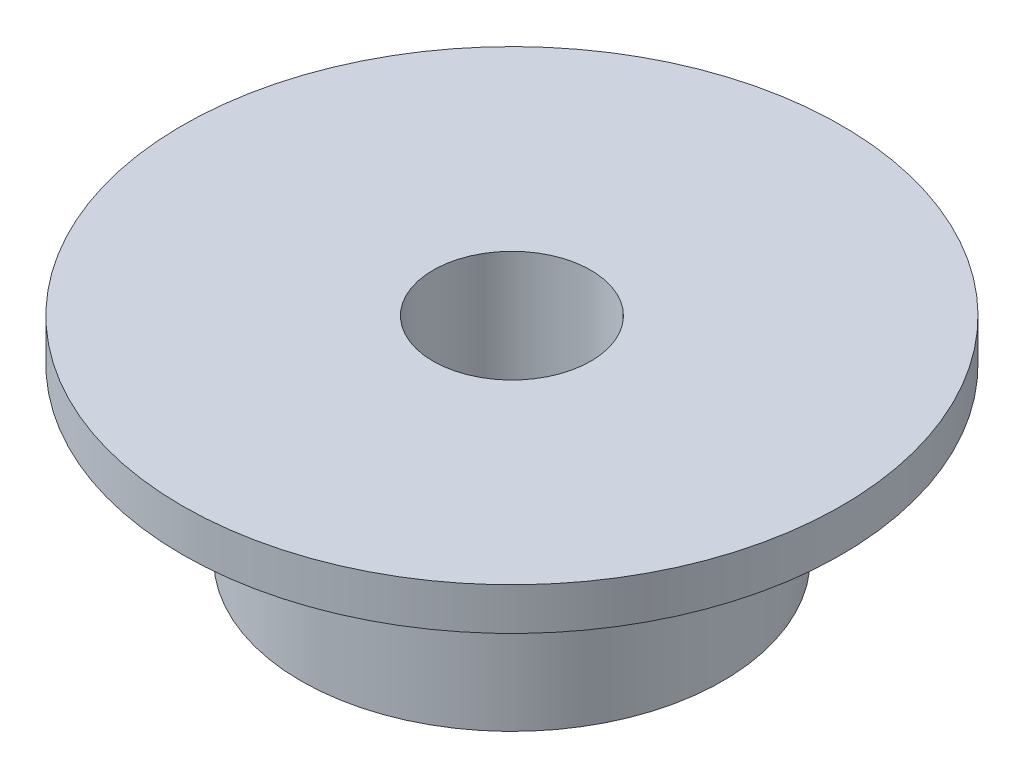
ISO-10303-21;
HEADER;
FILE_DESCRIPTION(('STEP AP214'),'2;1');
FILE_NAME('part.step','',(''),(''),'','','');
FILE_SCHEMA(('AUTOMOTIVE_DESIGN { 1 0 10303 214 1 1 1 1 }'));
ENDSEC;
DATA;
#1=APPLICATION_CONTEXT('core data for automotive mechanical design processes');
#2=APPLICATION_PROTOCOL_DEFINITION('international standard','automotive_design',2000,#1);
#3=PRODUCT_CONTEXT('',#1,'mechanical');
#4=PRODUCT('Part','Part','',(#3));
#5=PRODUCT_RELATED_PRODUCT_CATEGORY('part','',(#4));
#6=PRODUCT_DEFINITION_FORMATION('','',#4);
#7=PRODUCT_DEFINITION_CONTEXT('part definition',#1,'design');
#8=PRODUCT_DEFINITION('design','',#6,#7);
#9=PRODUCT_DEFINITION_SHAPE('','',#8);
#10=(LENGTH_UNIT() NAMED_UNIT(*) SI_UNIT(.MILLI.,.METRE.));
#11=(NAMED_UNIT(*) PLANE_ANGLE_UNIT() SI_UNIT($,.RADIAN.));
#12=(NAMED_UNIT(*) SI_UNIT($,.STERADIAN.) SOLID_ANGLE_UNIT());
#13=UNCERTAINTY_MEASURE_WITH_UNIT(LENGTH_MEASURE(1.E-05),#10,'distance_accuracy_value','');
#14=(GEOMETRIC_REPRESENTATION_CONTEXT(3) GLOBAL_UNCERTAINTY_ASSIGNED_CONTEXT((#13)) GLOBAL_UNIT_ASSIGNED_CONTEXT((#10,
#11,#12)) REPRESENTATION_CONTEXT('',''));
#15=CARTESIAN_POINT('',(0.,0.,0.));
#16=DIRECTION('',(0.,0.,1.));
#17=DIRECTION('',(1.,0.,0.));
#18=AXIS2_PLACEMENT_3D('',#15,#16,#17);
#19=CARTESIAN_POINT('',(-17.6073507354317,10.16,-10.4109004977317));
#20=DIRECTION('',(0.,-1.,0.));
#21=DIRECTION('',(0.,0.,-1.));
#22=AXIS2_PLACEMENT_3D('',#19,#20,#21);
#23=CYLINDRICAL_SURFACE('',#22,12.7);
#24=CARTESIAN_POINT('',(-17.6073507354317,10.16,-10.4109004977317));
#25=DIRECTION('',(0.,1.,0.));
#26=DIRECTION('',(0.,0.,1.));
#27=AXIS2_PLACEMENT_3D('',#24,#25,#26);
#28=CIRCLE('',#27,12.7);
#29=CARTESIAN_POINT('',(-17.6073507354317,10.16,2.28909950226825));
#30=VERTEX_POINT('',#29);
#31=EDGE_CURVE('E10',#30,#30,#28,.T.);
#32=ORIENTED_EDGE('',*,*,#31,.F.);
#33=EDGE_LOOP('',(#32));
#34=FACE_BOUND('',#33,.T.);
#35=CARTESIAN_POINT('',(-17.6073507354317,0.,-10.4109004977317));
#36=DIRECTION('',(0.,1.,0.));
#37=DIRECTION('',(0.,0.,1.));
#38=AXIS2_PLACEMENT_3D('',#35,#36,#37);
#39=CIRCLE('',#38,12.7);
#40=CARTESIAN_POINT('',(-17.6073507354317,0.,2.28909950226825));
#41=VERTEX_POINT('',#40);
#42=EDGE_CURVE('E38',#41,#41,#39,.T.);
#43=ORIENTED_EDGE('',*,*,#42,.T.);
#44=EDGE_LOOP('',(#43));
#45=FACE_BOUND('',#44,.T.);
#46=ADVANCED_FACE('F31',(#34,#45),#23,.T.);
#47=CARTESIAN_POINT('',(-17.6073507354317,0.,-10.4109004977317));
#48=DIRECTION('',(0.,1.,0.));
#49=DIRECTION('',(0.,0.,1.));
#50=AXIS2_PLACEMENT_3D('',#47,#48,#49);
#51=PLANE('',#50);
#52=CARTESIAN_POINT('',(-17.6073507354317,0.,-10.4109004977317));
#53=DIRECTION('',(0.,1.,0.));
#54=DIRECTION('',(0.,0.,1.));
#55=AXIS2_PLACEMENT_3D('',#52,#53,#54);
#56=CIRCLE('',#55,4.7498);
#57=CARTESIAN_POINT('',(-17.6073507354317,0.,-5.66110049773174));
#58=VERTEX_POINT('',#57);
#59=EDGE_CURVE('E34',#58,#58,#56,.T.);
#60=ORIENTED_EDGE('',*,*,#59,.T.);
#61=EDGE_LOOP('',(#60));
#62=FACE_BOUND('',#61,.T.);
#63=ORIENTED_EDGE('',*,*,#42,.F.);
#64=EDGE_LOOP('',(#63));
#65=FACE_BOUND('',#64,.T.);
#66=ADVANCED_FACE('F57',(#62,#65),#51,.F.);
#67=CARTESIAN_POINT('',(-17.6073507354317,10.16,-10.4109004977317));
#68=DIRECTION('',(0.,1.,0.));
#69=DIRECTION('',(0.,0.,1.));
#70=AXIS2_PLACEMENT_3D('',#67,#68,#69);
#71=PLANE('',#70);
#72=CARTESIAN_POINT('',(-17.6073507354317,10.16,-10.4109004977317));
#73=DIRECTION('',(0.,1.,0.));
#74=DIRECTION('',(0.,0.,1.));
#75=AXIS2_PLACEMENT_3D('',#72,#73,#74);
#76=CIRCLE('',#75,19.84375);
#77=CARTESIAN_POINT('',(-17.6073507354317,10.16,9.43284950226825));
#78=VERTEX_POINT('',#77);
#79=EDGE_CURVE('E45',#78,#78,#76,.T.);
#80=ORIENTED_EDGE('',*,*,#79,.F.);
#81=EDGE_LOOP('',(#80));
#82=FACE_BOUND('',#81,.T.);
#83=ORIENTED_EDGE('',*,*,#31,.T.);
#84=EDGE_LOOP('',(#83));
#85=FACE_BOUND('',#84,.T.);
#86=ADVANCED_FACE('F76',(#82,#85),#71,.F.);
#87=CARTESIAN_POINT('',(-17.6073507354317,12.7,-10.4109004977317));
#88=DIRECTION('',(0.,1.,0.));
#89=DIRECTION('',(0.,0.,1.));
#90=AXIS2_PLACEMENT_3D('',#87,#88,#89);
#91=PLANE('',#90);
#92=CARTESIAN_POINT('',(-17.6073507354317,12.7,-10.4109004977317));
#93=DIRECTION('',(0.,1.,0.));
#94=DIRECTION('',(0.,0.,1.));
#95=AXIS2_PLACEMENT_3D('',#92,#93,#94);
#96=CIRCLE('',#95,19.84375);
#97=CARTESIAN_POINT('',(-17.6073507354317,12.7,9.43284950226825));
#98=VERTEX_POINT('',#97);
#99=EDGE_CURVE('E43',#98,#98,#96,.T.);
#100=ORIENTED_EDGE('',*,*,#99,.T.);
#101=EDGE_LOOP('',(#100));
#102=FACE_BOUND('',#101,.T.);
#103=CARTESIAN_POINT('',(-17.6073507354317,12.7,-10.4109004977317));
#104=DIRECTION('',(0.,1.,0.));
#105=DIRECTION('',(0.,0.,1.));
#106=AXIS2_PLACEMENT_3D('',#103,#104,#105);
#107=CIRCLE('',#106,4.7498);
#108=CARTESIAN_POINT('',(-17.6073507354317,12.7,-5.66110049773174));
#109=VERTEX_POINT('',#108);
#110=EDGE_CURVE('E48',#109,#109,#107,.T.);
#111=ORIENTED_EDGE('',*,*,#110,.F.);
#112=EDGE_LOOP('',(#111));
#113=FACE_BOUND('',#112,.T.);
#114=ADVANCED_FACE('F67',(#102,#113),#91,.T.);
#115=CARTESIAN_POINT('',(-17.6073507354317,12.7,-10.4109004977317));
#116=DIRECTION('',(0.,-1.,0.));
#117=DIRECTION('',(0.,0.,-1.));
#118=AXIS2_PLACEMENT_3D('',#115,#116,#117);
#119=CYLINDRICAL_SURFACE('',#118,19.84375);
#120=ORIENTED_EDGE('',*,*,#99,.F.);
#121=EDGE_LOOP('',(#120));
#122=FACE_BOUND('',#121,.T.);
#123=ORIENTED_EDGE('',*,*,#79,.T.);
#124=EDGE_LOOP('',(#123));
#125=FACE_BOUND('',#124,.T.);
#126=ADVANCED_FACE('F62',(#122,#125),#119,.T.);
#127=CARTESIAN_POINT('',(-17.6073507354317,12.7,-10.4109004977317));
#128=DIRECTION('',(0.,-1.,0.));
#129=DIRECTION('',(0.,0.,-1.));
#130=AXIS2_PLACEMENT_3D('',#127,#128,#129);
#131=CYLINDRICAL_SURFACE('',#130,4.7498);
#132=ORIENTED_EDGE('',*,*,#110,.T.);
#133=EDGE_LOOP('',(#132));
#134=FACE_BOUND('',#133,.T.);
#135=ORIENTED_EDGE('',*,*,#59,.F.);
#136=EDGE_LOOP('',(#135));
#137=FACE_BOUND('',#136,.T.);
#138=ADVANCED_FACE('F60',(#134,#137),#131,.F.);
#139=CLOSED_SHELL('',(#46,#66,#86,#114,#126,#138));
#140=MANIFOLD_SOLID_BREP('B2',#139);
#141=ADVANCED_BREP_SHAPE_REPRESENTATION('',(#18,#140),#14);
#142=SHAPE_DEFINITION_REPRESENTATION(#9,#141);
ENDSEC;
END-ISO-10303-21;
